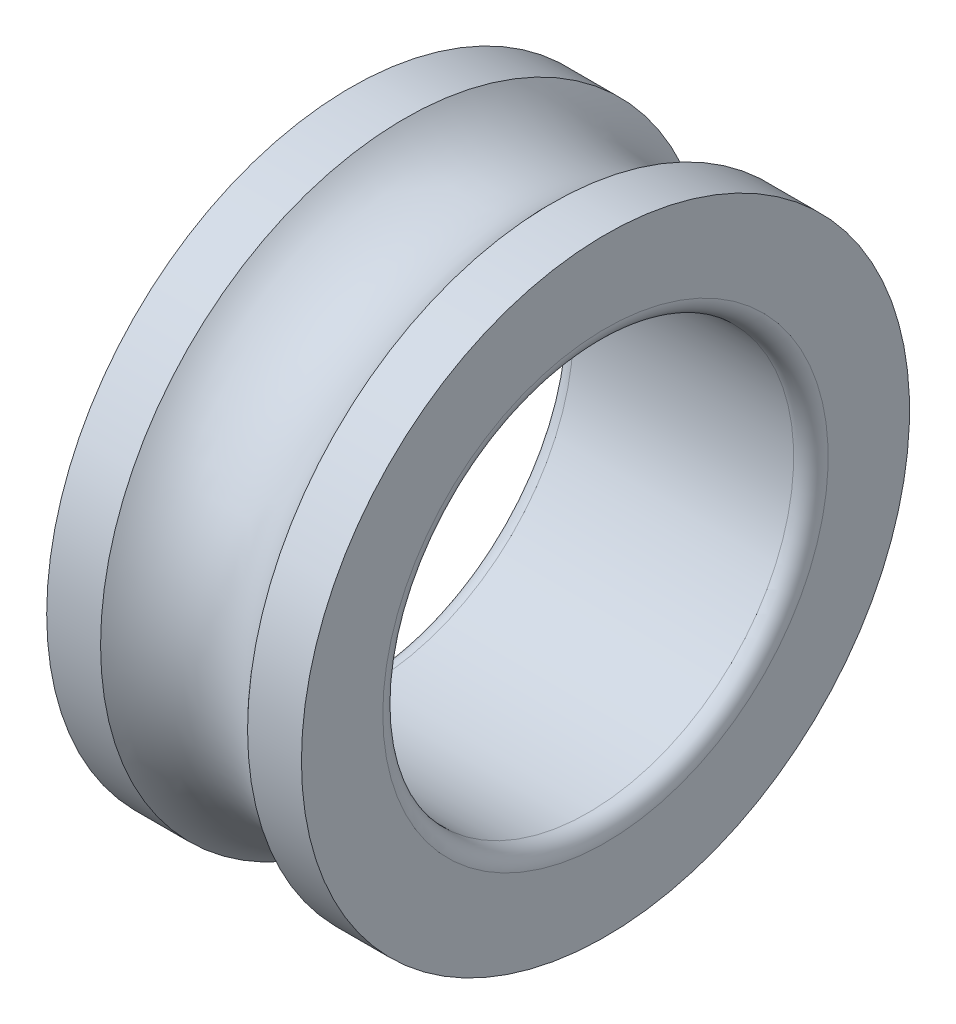
ISO-10303-21;
HEADER;
FILE_DESCRIPTION(('STEP AP214'),'2;1');
FILE_NAME('part.step','',(''),(''),'','','');
FILE_SCHEMA(('AUTOMOTIVE_DESIGN { 1 0 10303 214 1 1 1 1 }'));
ENDSEC;
DATA;
#1=APPLICATION_CONTEXT('core data for automotive mechanical design processes');
#2=APPLICATION_PROTOCOL_DEFINITION('international standard','automotive_design',2000,#1);
#3=PRODUCT_CONTEXT('',#1,'mechanical');
#4=PRODUCT('Part','Part','',(#3));
#5=PRODUCT_RELATED_PRODUCT_CATEGORY('part','',(#4));
#6=PRODUCT_DEFINITION_FORMATION('','',#4);
#7=PRODUCT_DEFINITION_CONTEXT('part definition',#1,'design');
#8=PRODUCT_DEFINITION('design','',#6,#7);
#9=PRODUCT_DEFINITION_SHAPE('','',#8);
#10=(LENGTH_UNIT() NAMED_UNIT(*) SI_UNIT(.MILLI.,.METRE.));
#11=(NAMED_UNIT(*) PLANE_ANGLE_UNIT() SI_UNIT($,.RADIAN.));
#12=(NAMED_UNIT(*) SI_UNIT($,.STERADIAN.) SOLID_ANGLE_UNIT());
#13=UNCERTAINTY_MEASURE_WITH_UNIT(LENGTH_MEASURE(1.E-05),#10,'distance_accuracy_value','');
#14=(GEOMETRIC_REPRESENTATION_CONTEXT(3) GLOBAL_UNCERTAINTY_ASSIGNED_CONTEXT((#13)) GLOBAL_UNIT_ASSIGNED_CONTEXT((#10,
#11,#12)) REPRESENTATION_CONTEXT('',''));
#15=CARTESIAN_POINT('',(0.,0.,0.));
#16=DIRECTION('',(0.,0.,1.));
#17=DIRECTION('',(1.,0.,0.));
#18=AXIS2_PLACEMENT_3D('',#15,#16,#17);
#19=CARTESIAN_POINT('',(-15.5,37.,0.));
#20=DIRECTION('',(1.,0.,0.));
#21=DIRECTION('',(0.,0.,-1.));
#22=AXIS2_PLACEMENT_3D('',#19,#20,#21);
#23=PLANE('',#22);
#24=CARTESIAN_POINT('',(-15.5,0.,0.));
#25=DIRECTION('',(-1.,0.,0.));
#26=DIRECTION('',(0.,0.,1.));
#27=AXIS2_PLACEMENT_3D('',#24,#25,#26);
#28=CIRCLE('',#27,27.1);
#29=CARTESIAN_POINT('',(-15.5,0.,27.1));
#30=VERTEX_POINT('',#29);
#31=EDGE_CURVE('E10',#30,#30,#28,.T.);
#32=ORIENTED_EDGE('',*,*,#31,.F.);
#33=EDGE_LOOP('',(#32));
#34=FACE_BOUND('',#33,.T.);
#35=CARTESIAN_POINT('',(-15.5,0.,0.));
#36=DIRECTION('',(-1.,0.,0.));
#37=DIRECTION('',(0.,0.,1.));
#38=AXIS2_PLACEMENT_3D('',#35,#36,#37);
#39=CIRCLE('',#38,37.);
#40=CARTESIAN_POINT('',(-15.5,0.,37.));
#41=VERTEX_POINT('',#40);
#42=EDGE_CURVE('E76',#41,#41,#39,.T.);
#43=ORIENTED_EDGE('',*,*,#42,.T.);
#44=EDGE_LOOP('',(#43));
#45=FACE_BOUND('',#44,.T.);
#46=ADVANCED_FACE('F41',(#34,#45),#23,.F.);
#47=CARTESIAN_POINT('',(-13.4,0.,0.));
#48=DIRECTION('',(-1.,0.,0.));
#49=DIRECTION('',(0.,0.,1.));
#50=AXIS2_PLACEMENT_3D('',#47,#48,#49);
#51=TOROIDAL_SURFACE('',#50,27.1,2.1);
#52=CARTESIAN_POINT('',(-13.4,0.,0.));
#53=DIRECTION('',(-1.,0.,0.));
#54=DIRECTION('',(0.,0.,1.));
#55=AXIS2_PLACEMENT_3D('',#52,#53,#54);
#56=CIRCLE('',#55,25.);
#57=CARTESIAN_POINT('',(-13.4,0.,25.));
#58=VERTEX_POINT('',#57);
#59=EDGE_CURVE('E48',#58,#58,#56,.T.);
#60=ORIENTED_EDGE('',*,*,#59,.F.);
#61=EDGE_LOOP('',(#60));
#62=FACE_BOUND('',#61,.T.);
#63=ORIENTED_EDGE('',*,*,#31,.T.);
#64=EDGE_LOOP('',(#63));
#65=FACE_BOUND('',#64,.T.);
#66=ADVANCED_FACE('F114',(#62,#65),#51,.T.);
#67=CARTESIAN_POINT('',(-38.3579043834186,0.,0.));
#68=DIRECTION('',(-1.,0.,0.));
#69=DIRECTION('',(0.,0.,1.));
#70=AXIS2_PLACEMENT_3D('',#67,#68,#69);
#71=CYLINDRICAL_SURFACE('',#70,25.);
#72=CARTESIAN_POINT('',(13.4,0.,0.));
#73=DIRECTION('',(-1.,0.,0.));
#74=DIRECTION('',(0.,0.,1.));
#75=AXIS2_PLACEMENT_3D('',#72,#73,#74);
#76=CIRCLE('',#75,25.);
#77=CARTESIAN_POINT('',(13.4,0.,25.));
#78=VERTEX_POINT('',#77);
#79=EDGE_CURVE('E53',#78,#78,#76,.T.);
#80=ORIENTED_EDGE('',*,*,#79,.F.);
#81=EDGE_LOOP('',(#80));
#82=FACE_BOUND('',#81,.T.);
#83=ORIENTED_EDGE('',*,*,#59,.T.);
#84=EDGE_LOOP('',(#83));
#85=FACE_BOUND('',#84,.T.);
#86=ADVANCED_FACE('F109',(#82,#85),#71,.F.);
#87=CARTESIAN_POINT('',(13.4,0.,0.));
#88=DIRECTION('',(-1.,0.,0.));
#89=DIRECTION('',(0.,0.,1.));
#90=AXIS2_PLACEMENT_3D('',#87,#88,#89);
#91=TOROIDAL_SURFACE('',#90,27.1,2.1);
#92=CARTESIAN_POINT('',(15.5,0.,0.));
#93=DIRECTION('',(-1.,0.,0.));
#94=DIRECTION('',(0.,0.,1.));
#95=AXIS2_PLACEMENT_3D('',#92,#93,#94);
#96=CIRCLE('',#95,27.1);
#97=CARTESIAN_POINT('',(15.5,0.,27.1));
#98=VERTEX_POINT('',#97);
#99=EDGE_CURVE('E58',#98,#98,#96,.T.);
#100=ORIENTED_EDGE('',*,*,#99,.F.);
#101=EDGE_LOOP('',(#100));
#102=FACE_BOUND('',#101,.T.);
#103=ORIENTED_EDGE('',*,*,#79,.T.);
#104=EDGE_LOOP('',(#103));
#105=FACE_BOUND('',#104,.T.);
#106=ADVANCED_FACE('F103',(#102,#105),#91,.T.);
#107=CARTESIAN_POINT('',(15.5,37.,0.));
#108=DIRECTION('',(-1.,0.,0.));
#109=DIRECTION('',(0.,0.,1.));
#110=AXIS2_PLACEMENT_3D('',#107,#108,#109);
#111=PLANE('',#110);
#112=CARTESIAN_POINT('',(15.5,0.,0.));
#113=DIRECTION('',(-1.,0.,0.));
#114=DIRECTION('',(0.,0.,1.));
#115=AXIS2_PLACEMENT_3D('',#112,#113,#114);
#116=CIRCLE('',#115,37.);
#117=CARTESIAN_POINT('',(15.5,0.,37.));
#118=VERTEX_POINT('',#117);
#119=EDGE_CURVE('E64',#118,#118,#116,.T.);
#120=ORIENTED_EDGE('',*,*,#119,.F.);
#121=EDGE_LOOP('',(#120));
#122=FACE_BOUND('',#121,.T.);
#123=ORIENTED_EDGE('',*,*,#99,.T.);
#124=EDGE_LOOP('',(#123));
#125=FACE_BOUND('',#124,.T.);
#126=ADVANCED_FACE('F97',(#122,#125),#111,.F.);
#127=CARTESIAN_POINT('',(-38.3579043834186,0.,0.));
#128=DIRECTION('',(-1.,0.,0.));
#129=DIRECTION('',(0.,0.,1.));
#130=AXIS2_PLACEMENT_3D('',#127,#128,#129);
#131=CYLINDRICAL_SURFACE('',#130,37.);
#132=CARTESIAN_POINT('',(8.94427190999915,0.,0.));
#133=DIRECTION('',(-1.,0.,0.));
#134=DIRECTION('',(0.,0.,1.));
#135=AXIS2_PLACEMENT_3D('',#132,#133,#134);
#136=CIRCLE('',#135,37.);
#137=CARTESIAN_POINT('',(8.94427190999915,0.,37.));
#138=VERTEX_POINT('',#137);
#139=EDGE_CURVE('E68',#138,#138,#136,.T.);
#140=ORIENTED_EDGE('',*,*,#139,.F.);
#141=EDGE_LOOP('',(#140));
#142=FACE_BOUND('',#141,.T.);
#143=ORIENTED_EDGE('',*,*,#119,.T.);
#144=EDGE_LOOP('',(#143));
#145=FACE_BOUND('',#144,.T.);
#146=ADVANCED_FACE('F91',(#142,#145),#131,.T.);
#147=CARTESIAN_POINT('',(0.,0.,0.));
#148=DIRECTION('',(-1.,0.,0.));
#149=DIRECTION('',(0.,0.,1.));
#150=AXIS2_PLACEMENT_3D('',#147,#148,#149);
#151=TOROIDAL_SURFACE('',#150,45.,12.);
#152=CARTESIAN_POINT('',(-8.94427190999917,0.,0.));
#153=DIRECTION('',(-1.,0.,0.));
#154=DIRECTION('',(0.,0.,1.));
#155=AXIS2_PLACEMENT_3D('',#152,#153,#154);
#156=CIRCLE('',#155,37.);
#157=CARTESIAN_POINT('',(-8.94427190999917,0.,37.));
#158=VERTEX_POINT('',#157);
#159=EDGE_CURVE('E72',#158,#158,#156,.T.);
#160=ORIENTED_EDGE('',*,*,#159,.F.);
#161=EDGE_LOOP('',(#160));
#162=FACE_BOUND('',#161,.T.);
#163=ORIENTED_EDGE('',*,*,#139,.T.);
#164=EDGE_LOOP('',(#163));
#165=FACE_BOUND('',#164,.T.);
#166=ADVANCED_FACE('F85',(#162,#165),#151,.F.);
#167=CARTESIAN_POINT('',(-38.3579043834186,0.,0.));
#168=DIRECTION('',(-1.,0.,0.));
#169=DIRECTION('',(0.,0.,1.));
#170=AXIS2_PLACEMENT_3D('',#167,#168,#169);
#171=CYLINDRICAL_SURFACE('',#170,37.);
#172=ORIENTED_EDGE('',*,*,#42,.F.);
#173=EDGE_LOOP('',(#172));
#174=FACE_BOUND('',#173,.T.);
#175=ORIENTED_EDGE('',*,*,#159,.T.);
#176=EDGE_LOOP('',(#175));
#177=FACE_BOUND('',#176,.T.);
#178=ADVANCED_FACE('F82',(#174,#177),#171,.T.);
#179=CLOSED_SHELL('',(#46,#66,#86,#106,#126,#146,#166,#178));
#180=MANIFOLD_SOLID_BREP('B2',#179);
#181=ADVANCED_BREP_SHAPE_REPRESENTATION('',(#18,#180),#14);
#182=SHAPE_DEFINITION_REPRESENTATION(#9,#181);
ENDSEC;
END-ISO-10303-21;
